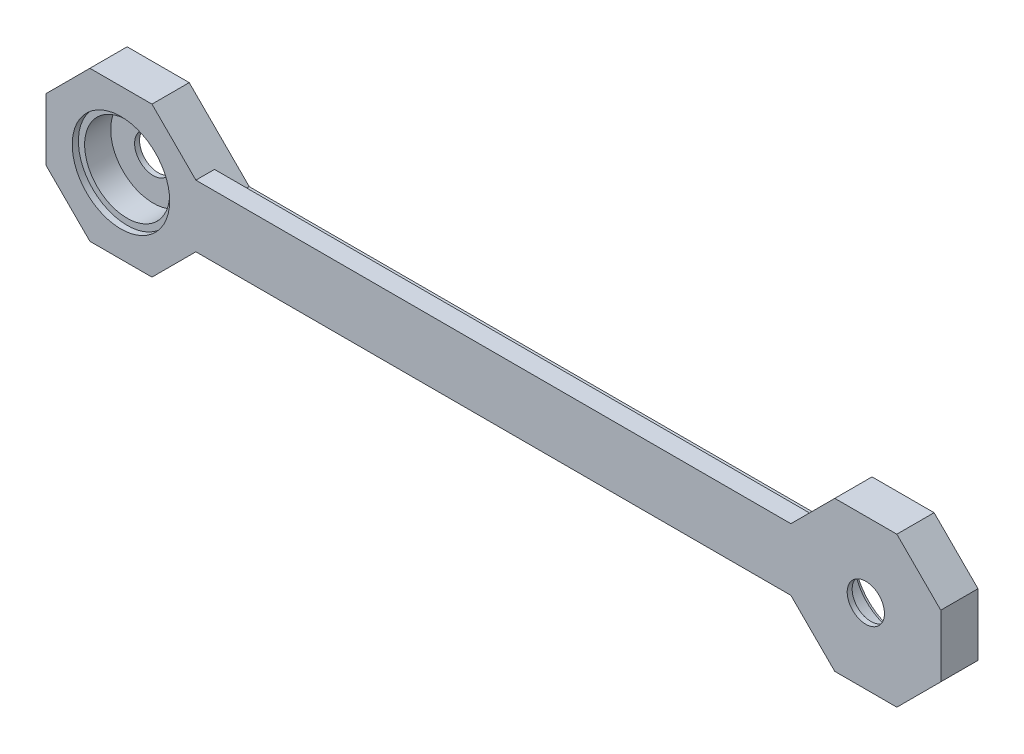
ISO-10303-21;
HEADER;
FILE_DESCRIPTION(('STEP AP214'),'2;1');
FILE_NAME('part.step','',(''),(''),'','','');
FILE_SCHEMA(('AUTOMOTIVE_DESIGN { 1 0 10303 214 1 1 1 1 }'));
ENDSEC;
DATA;
#1=APPLICATION_CONTEXT('core data for automotive mechanical design processes');
#2=APPLICATION_PROTOCOL_DEFINITION('international standard','automotive_design',2000,#1);
#3=PRODUCT_CONTEXT('',#1,'mechanical');
#4=PRODUCT('Part','Part','',(#3));
#5=PRODUCT_RELATED_PRODUCT_CATEGORY('part','',(#4));
#6=PRODUCT_DEFINITION_FORMATION('','',#4);
#7=PRODUCT_DEFINITION_CONTEXT('part definition',#1,'design');
#8=PRODUCT_DEFINITION('design','',#6,#7);
#9=PRODUCT_DEFINITION_SHAPE('','',#8);
#10=(LENGTH_UNIT() NAMED_UNIT(*) SI_UNIT(.MILLI.,.METRE.));
#11=(NAMED_UNIT(*) PLANE_ANGLE_UNIT() SI_UNIT($,.RADIAN.));
#12=(NAMED_UNIT(*) SI_UNIT($,.STERADIAN.) SOLID_ANGLE_UNIT());
#13=UNCERTAINTY_MEASURE_WITH_UNIT(LENGTH_MEASURE(1.E-05),#10,'distance_accuracy_value','');
#14=(GEOMETRIC_REPRESENTATION_CONTEXT(3) GLOBAL_UNCERTAINTY_ASSIGNED_CONTEXT((#13)) GLOBAL_UNIT_ASSIGNED_CONTEXT((#10,
#11,#12)) REPRESENTATION_CONTEXT('',''));
#15=CARTESIAN_POINT('',(0.,0.,0.));
#16=DIRECTION('',(0.,0.,1.));
#17=DIRECTION('',(1.,0.,0.));
#18=AXIS2_PLACEMENT_3D('',#15,#16,#17);
#19=CARTESIAN_POINT('',(-120.,0.,-5.2));
#20=DIRECTION('',(0.,0.,1.));
#21=DIRECTION('',(1.,0.,0.));
#22=AXIS2_PLACEMENT_3D('',#19,#20,#21);
#23=CYLINDRICAL_SURFACE('',#22,6.85);
#24=CARTESIAN_POINT('',(-120.,0.,-5.2));
#25=DIRECTION('',(0.,0.,1.));
#26=DIRECTION('',(1.,0.,0.));
#27=AXIS2_PLACEMENT_3D('',#24,#25,#26);
#28=CIRCLE('',#27,6.85);
#29=CARTESIAN_POINT('',(-113.15,0.,-5.2));
#30=VERTEX_POINT('',#29);
#31=EDGE_CURVE('E302',#30,#30,#28,.T.);
#32=ORIENTED_EDGE('',*,*,#31,.F.);
#33=EDGE_LOOP('',(#32));
#34=FACE_BOUND('',#33,.T.);
#35=CARTESIAN_POINT('',(-120.,0.,-1.));
#36=DIRECTION('',(0.,0.,1.));
#37=DIRECTION('',(1.,0.,0.));
#38=AXIS2_PLACEMENT_3D('',#35,#36,#37);
#39=CIRCLE('',#38,6.85);
#40=CARTESIAN_POINT('',(-113.15,0.,-1.));
#41=VERTEX_POINT('',#40);
#42=EDGE_CURVE('E45',#41,#41,#39,.F.);
#43=ORIENTED_EDGE('',*,*,#42,.F.);
#44=EDGE_LOOP('',(#43));
#45=FACE_BOUND('',#44,.T.);
#46=ADVANCED_FACE('F41',(#34,#45),#23,.F.);
#47=CARTESIAN_POINT('',(-120.,0.,-6.));
#48=DIRECTION('',(0.,0.,1.));
#49=DIRECTION('',(1.,0.,0.));
#50=AXIS2_PLACEMENT_3D('',#47,#48,#49);
#51=CYLINDRICAL_SURFACE('',#50,3.00000000000001);
#52=CARTESIAN_POINT('',(-120.,0.,-6.));
#53=DIRECTION('',(0.,0.,1.));
#54=DIRECTION('',(1.,0.,0.));
#55=AXIS2_PLACEMENT_3D('',#52,#53,#54);
#56=CIRCLE('',#55,3.00000000000001);
#57=CARTESIAN_POINT('',(-117.,0.,-6.));
#58=VERTEX_POINT('',#57);
#59=EDGE_CURVE('E243',#58,#58,#56,.T.);
#60=ORIENTED_EDGE('',*,*,#59,.F.);
#61=EDGE_LOOP('',(#60));
#62=FACE_BOUND('',#61,.T.);
#63=CARTESIAN_POINT('',(-120.,0.,-5.2));
#64=DIRECTION('',(0.,0.,1.));
#65=DIRECTION('',(1.,0.,0.));
#66=AXIS2_PLACEMENT_3D('',#63,#64,#65);
#67=CIRCLE('',#66,3.00000000000001);
#68=CARTESIAN_POINT('',(-117.,0.,-5.2));
#69=VERTEX_POINT('',#68);
#70=EDGE_CURVE('E298',#69,#69,#67,.F.);
#71=ORIENTED_EDGE('',*,*,#70,.F.);
#72=EDGE_LOOP('',(#71));
#73=FACE_BOUND('',#72,.T.);
#74=ADVANCED_FACE('F524',(#62,#73),#51,.F.);
#75=CARTESIAN_POINT('',(0.,0.,-0.8));
#76=DIRECTION('',(0.,0.,-1.));
#77=DIRECTION('',(-1.,0.,0.));
#78=AXIS2_PLACEMENT_3D('',#75,#76,#77);
#79=CYLINDRICAL_SURFACE('',#78,6.85);
#80=CARTESIAN_POINT('',(0.,0.,-0.8));
#81=DIRECTION('',(0.,0.,-1.));
#82=DIRECTION('',(-1.,0.,0.));
#83=AXIS2_PLACEMENT_3D('',#80,#81,#82);
#84=CIRCLE('',#83,6.85);
#85=CARTESIAN_POINT('',(-6.85,0.,-0.8));
#86=VERTEX_POINT('',#85);
#87=EDGE_CURVE('E293',#86,#86,#84,.T.);
#88=ORIENTED_EDGE('',*,*,#87,.F.);
#89=EDGE_LOOP('',(#88));
#90=FACE_BOUND('',#89,.T.);
#91=CARTESIAN_POINT('',(0.,0.,-5.));
#92=DIRECTION('',(0.,0.,-1.));
#93=DIRECTION('',(-1.,0.,0.));
#94=AXIS2_PLACEMENT_3D('',#91,#92,#93);
#95=CIRCLE('',#94,6.85);
#96=CARTESIAN_POINT('',(-6.85,0.,-5.));
#97=VERTEX_POINT('',#96);
#98=EDGE_CURVE('E294',#97,#97,#95,.F.);
#99=ORIENTED_EDGE('',*,*,#98,.F.);
#100=EDGE_LOOP('',(#99));
#101=FACE_BOUND('',#100,.T.);
#102=ADVANCED_FACE('F530',(#90,#101),#79,.F.);
#103=CARTESIAN_POINT('',(0.,0.,-6.));
#104=DIRECTION('',(0.,0.,1.));
#105=DIRECTION('',(1.,0.,0.));
#106=AXIS2_PLACEMENT_3D('',#103,#104,#105);
#107=CYLINDRICAL_SURFACE('',#106,3.);
#108=CARTESIAN_POINT('',(0.,0.,0.));
#109=DIRECTION('',(0.,0.,1.));
#110=DIRECTION('',(1.,0.,0.));
#111=AXIS2_PLACEMENT_3D('',#108,#109,#110);
#112=CIRCLE('',#111,3.);
#113=CARTESIAN_POINT('',(3.,0.,0.));
#114=VERTEX_POINT('',#113);
#115=EDGE_CURVE('E187',#114,#114,#112,.T.);
#116=ORIENTED_EDGE('',*,*,#115,.T.);
#117=EDGE_LOOP('',(#116));
#118=FACE_BOUND('',#117,.T.);
#119=CARTESIAN_POINT('',(0.,0.,-0.8));
#120=DIRECTION('',(0.,0.,-1.));
#121=DIRECTION('',(-1.,0.,0.));
#122=AXIS2_PLACEMENT_3D('',#119,#120,#121);
#123=CIRCLE('',#122,3.);
#124=CARTESIAN_POINT('',(-3.,0.,-0.8));
#125=VERTEX_POINT('',#124);
#126=EDGE_CURVE('E288',#125,#125,#123,.F.);
#127=ORIENTED_EDGE('',*,*,#126,.F.);
#128=EDGE_LOOP('',(#127));
#129=FACE_BOUND('',#128,.T.);
#130=ADVANCED_FACE('F43',(#118,#129),#107,.F.);
#131=CARTESIAN_POINT('',(-51.4644660940659,-51.4644660940671,-6.));
#132=DIRECTION('',(-0.707106781186539,-0.707106781186556,0.));
#133=DIRECTION('',(0.707106781186556,-0.707106781186539,0.));
#134=AXIS2_PLACEMENT_3D('',#131,#132,#133);
#135=PLANE('',#134);
#136=DIRECTION('',(0.,0.,1.));
#137=VECTOR('',#136,1.);
#138=CARTESIAN_POINT('',(-107.928932188134,5.,-3.));
#139=LINE('',#138,#137);
#140=CARTESIAN_POINT('',(-107.928932188134,5.,-3.));
#141=VERTEX_POINT('',#140);
#142=CARTESIAN_POINT('',(-107.928932188134,5.,0.));
#143=VERTEX_POINT('',#142);
#144=EDGE_CURVE('E346',#141,#143,#139,.T.);
#145=ORIENTED_EDGE('',*,*,#144,.F.);
#146=DIRECTION('',(-0.707106781186557,0.707106781186538,0.));
#147=VECTOR('',#146,1.);
#148=CARTESIAN_POINT('',(-51.4644660940658,-51.4644660940671,-3.));
#149=LINE('',#148,#147);
#150=CARTESIAN_POINT('',(-105.323640603008,2.39470841487357,-3.));
#151=VERTEX_POINT('',#150);
#152=EDGE_CURVE('E338',#151,#141,#149,.T.);
#153=ORIENTED_EDGE('',*,*,#152,.F.);
#154=DIRECTION('',(0.,0.,1.));
#155=VECTOR('',#154,1.);
#156=CARTESIAN_POINT('',(-105.323640603008,2.39470841487357,-6.));
#157=LINE('',#156,#155);
#158=CARTESIAN_POINT('',(-105.323640603008,2.39470841487357,-6.));
#159=VERTEX_POINT('',#158);
#160=EDGE_CURVE('E255',#159,#151,#157,.T.);
#161=ORIENTED_EDGE('',*,*,#160,.F.);
#162=DIRECTION('',(0.707106781186556,-0.707106781186539,0.));
#163=VECTOR('',#162,1.);
#164=CARTESIAN_POINT('',(-51.4644660940659,-51.4644660940671,-6.));
#165=LINE('',#164,#163);
#166=CARTESIAN_POINT('',(-115.,12.0710678118655,-6.));
#167=VERTEX_POINT('',#166);
#168=EDGE_CURVE('E419',#167,#159,#165,.T.);
#169=ORIENTED_EDGE('',*,*,#168,.F.);
#170=DIRECTION('',(0.,0.,1.));
#171=VECTOR('',#170,1.);
#172=CARTESIAN_POINT('',(-115.,12.0710678118655,-6.));
#173=LINE('',#172,#171);
#174=CARTESIAN_POINT('',(-115.,12.0710678118655,0.));
#175=VERTEX_POINT('',#174);
#176=EDGE_CURVE('E252',#167,#175,#173,.T.);
#177=ORIENTED_EDGE('',*,*,#176,.T.);
#178=DIRECTION('',(0.707106781186556,-0.707106781186539,0.));
#179=VECTOR('',#178,1.);
#180=CARTESIAN_POINT('',(-51.4644660940659,-51.4644660940671,0.));
#181=LINE('',#180,#179);
#182=EDGE_CURVE('E223',#175,#143,#181,.T.);
#183=ORIENTED_EDGE('',*,*,#182,.T.);
#184=EDGE_LOOP('',(#145,#153,#161,#169,#177,#183));
#185=FACE_BOUND('',#184,.T.);
#186=ADVANCED_FACE('F441',(#185),#135,.F.);
#187=CARTESIAN_POINT('',(0.,2.3947084148733,-6.));
#188=DIRECTION('',(0.,-1.,0.));
#189=DIRECTION('',(1.,0.,0.));
#190=AXIS2_PLACEMENT_3D('',#187,#188,#189);
#191=PLANE('',#190);
#192=DIRECTION('',(-1.,0.,0.));
#193=VECTOR('',#192,1.);
#194=CARTESIAN_POINT('',(0.,2.39470841487329,-3.));
#195=LINE('',#194,#193);
#196=CARTESIAN_POINT('',(-14.6763593969918,2.39470841487333,-3.));
#197=VERTEX_POINT('',#196);
#198=EDGE_CURVE('E326',#197,#151,#195,.T.);
#199=ORIENTED_EDGE('',*,*,#198,.F.);
#200=DIRECTION('',(0.,0.,1.));
#201=VECTOR('',#200,1.);
#202=CARTESIAN_POINT('',(-14.6763593969919,2.39470841487333,-6.));
#203=LINE('',#202,#201);
#204=CARTESIAN_POINT('',(-14.6763593969919,2.39470841487333,-6.));
#205=VERTEX_POINT('',#204);
#206=EDGE_CURVE('E259',#205,#197,#203,.T.);
#207=ORIENTED_EDGE('',*,*,#206,.F.);
#208=DIRECTION('',(1.,0.,0.));
#209=VECTOR('',#208,1.);
#210=CARTESIAN_POINT('',(0.,2.3947084148733,-6.));
#211=LINE('',#210,#209);
#212=EDGE_CURVE('E416',#159,#205,#211,.T.);
#213=ORIENTED_EDGE('',*,*,#212,.F.);
#214=ORIENTED_EDGE('',*,*,#160,.T.);
#215=EDGE_LOOP('',(#199,#207,#213,#214));
#216=FACE_BOUND('',#215,.T.);
#217=ADVANCED_FACE('F481',(#216),#191,.F.);
#218=CARTESIAN_POINT('',(-8.53553390593273,8.53553390593273,-6.));
#219=DIRECTION('',(-0.707106781186548,0.707106781186547,0.));
#220=DIRECTION('',(-0.707106781186547,-0.707106781186548,0.));
#221=AXIS2_PLACEMENT_3D('',#218,#219,#220);
#222=PLANE('',#221);
#223=DIRECTION('',(0.707106781186535,0.70710678118656,0.));
#224=VECTOR('',#223,1.);
#225=CARTESIAN_POINT('',(-8.53553390593284,8.53553390593255,-3.));
#226=LINE('',#225,#224);
#227=CARTESIAN_POINT('',(-12.0710678118653,4.99999999999999,-3.));
#228=VERTEX_POINT('',#227);
#229=EDGE_CURVE('E330',#197,#228,#226,.T.);
#230=ORIENTED_EDGE('',*,*,#229,.T.);
#231=DIRECTION('',(0.,0.,1.));
#232=VECTOR('',#231,1.);
#233=CARTESIAN_POINT('',(-12.0710678118653,4.99999999999999,-3.));
#234=LINE('',#233,#232);
#235=CARTESIAN_POINT('',(-12.0710678118653,4.99999999999999,0.));
#236=VERTEX_POINT('',#235);
#237=EDGE_CURVE('E342',#228,#236,#234,.T.);
#238=ORIENTED_EDGE('',*,*,#237,.T.);
#239=DIRECTION('',(-0.707106781186547,-0.707106781186548,0.));
#240=VECTOR('',#239,1.);
#241=CARTESIAN_POINT('',(-8.53553390593273,8.53553390593273,0.));
#242=LINE('',#241,#240);
#243=CARTESIAN_POINT('',(-5.,12.0710678118655,0.));
#244=VERTEX_POINT('',#243);
#245=EDGE_CURVE('E219',#244,#236,#242,.T.);
#246=ORIENTED_EDGE('',*,*,#245,.F.);
#247=DIRECTION('',(0.,0.,1.));
#248=VECTOR('',#247,1.);
#249=CARTESIAN_POINT('',(-5.,12.0710678118655,-6.));
#250=LINE('',#249,#248);
#251=CARTESIAN_POINT('',(-5.,12.0710678118655,-6.));
#252=VERTEX_POINT('',#251);
#253=EDGE_CURVE('E263',#252,#244,#250,.T.);
#254=ORIENTED_EDGE('',*,*,#253,.F.);
#255=DIRECTION('',(-0.707106781186547,-0.707106781186548,0.));
#256=VECTOR('',#255,1.);
#257=CARTESIAN_POINT('',(-8.53553390593273,8.53553390593273,-6.));
#258=LINE('',#257,#256);
#259=EDGE_CURVE('E412',#252,#205,#258,.T.);
#260=ORIENTED_EDGE('',*,*,#259,.T.);
#261=ORIENTED_EDGE('',*,*,#206,.T.);
#262=EDGE_LOOP('',(#230,#238,#246,#254,#260,#261));
#263=FACE_BOUND('',#262,.T.);
#264=ADVANCED_FACE('F477',(#263),#222,.T.);
#265=CARTESIAN_POINT('',(0.,-2.39470841487359,-6.));
#266=DIRECTION('',(0.,-1.,0.));
#267=DIRECTION('',(1.,0.,0.));
#268=AXIS2_PLACEMENT_3D('',#265,#266,#267);
#269=PLANE('',#268);
#270=DIRECTION('',(0.,0.,1.));
#271=VECTOR('',#270,1.);
#272=CARTESIAN_POINT('',(-14.6763593969922,-2.39470841487355,-6.));
#273=LINE('',#272,#271);
#274=CARTESIAN_POINT('',(-14.6763593969922,-2.39470841487355,-6.));
#275=VERTEX_POINT('',#274);
#276=CARTESIAN_POINT('',(-14.6763593969918,-2.39470841487333,-3.));
#277=VERTEX_POINT('',#276);
#278=EDGE_CURVE('E282',#275,#277,#273,.T.);
#279=ORIENTED_EDGE('',*,*,#278,.T.);
#280=DIRECTION('',(-1.,0.,0.));
#281=VECTOR('',#280,1.);
#282=CARTESIAN_POINT('',(0.,-2.39470841487329,-3.));
#283=LINE('',#282,#281);
#284=CARTESIAN_POINT('',(-105.323640603008,-2.39470841487357,-3.));
#285=VERTEX_POINT('',#284);
#286=EDGE_CURVE('E358',#277,#285,#283,.T.);
#287=ORIENTED_EDGE('',*,*,#286,.T.);
#288=DIRECTION('',(0.,0.,1.));
#289=VECTOR('',#288,1.);
#290=CARTESIAN_POINT('',(-105.323640603008,-2.39470841487333,-6.));
#291=LINE('',#290,#289);
#292=CARTESIAN_POINT('',(-105.323640603008,-2.39470841487333,-6.));
#293=VERTEX_POINT('',#292);
#294=EDGE_CURVE('E113',#293,#285,#291,.T.);
#295=ORIENTED_EDGE('',*,*,#294,.F.);
#296=DIRECTION('',(1.,0.,0.));
#297=VECTOR('',#296,1.);
#298=CARTESIAN_POINT('',(0.,-2.39470841487359,-6.));
#299=LINE('',#298,#297);
#300=EDGE_CURVE('E385',#293,#275,#299,.T.);
#301=ORIENTED_EDGE('',*,*,#300,.T.);
#302=EDGE_LOOP('',(#279,#287,#295,#301));
#303=FACE_BOUND('',#302,.T.);
#304=ADVANCED_FACE('F508',(#303),#269,.T.);
#305=CARTESIAN_POINT('',(-51.4644660940682,51.4644660940674,-6.));
#306=DIRECTION('',(0.707106781186553,-0.707106781186542,0.));
#307=DIRECTION('',(0.707106781186542,0.707106781186553,0.));
#308=AXIS2_PLACEMENT_3D('',#305,#306,#307);
#309=PLANE('',#308);
#310=DIRECTION('',(0.,0.,1.));
#311=VECTOR('',#310,1.);
#312=CARTESIAN_POINT('',(-107.928932188134,-5.,-3.));
#313=LINE('',#312,#311);
#314=CARTESIAN_POINT('',(-107.928932188134,-5.,-3.));
#315=VERTEX_POINT('',#314);
#316=CARTESIAN_POINT('',(-107.928932188134,-5.,0.));
#317=VERTEX_POINT('',#316);
#318=EDGE_CURVE('E369',#315,#317,#313,.T.);
#319=ORIENTED_EDGE('',*,*,#318,.T.);
#320=DIRECTION('',(0.707106781186542,0.707106781186553,0.));
#321=VECTOR('',#320,1.);
#322=CARTESIAN_POINT('',(-51.4644660940682,51.4644660940674,0.));
#323=LINE('',#322,#321);
#324=CARTESIAN_POINT('',(-115.,-12.0710678118655,0.));
#325=VERTEX_POINT('',#324);
#326=EDGE_CURVE('E191',#325,#317,#323,.T.);
#327=ORIENTED_EDGE('',*,*,#326,.F.);
#328=DIRECTION('',(0.,0.,1.));
#329=VECTOR('',#328,1.);
#330=CARTESIAN_POINT('',(-115.,-12.0710678118655,-6.));
#331=LINE('',#330,#329);
#332=CARTESIAN_POINT('',(-115.,-12.0710678118655,-6.));
#333=VERTEX_POINT('',#332);
#334=EDGE_CURVE('E11',#333,#325,#331,.T.);
#335=ORIENTED_EDGE('',*,*,#334,.F.);
#336=DIRECTION('',(0.707106781186542,0.707106781186553,0.));
#337=VECTOR('',#336,1.);
#338=CARTESIAN_POINT('',(-51.4644660940682,51.4644660940674,-6.));
#339=LINE('',#338,#337);
#340=EDGE_CURVE('E382',#333,#293,#339,.T.);
#341=ORIENTED_EDGE('',*,*,#340,.T.);
#342=ORIENTED_EDGE('',*,*,#294,.T.);
#343=DIRECTION('',(-0.707106781186557,-0.707106781186538,0.));
#344=VECTOR('',#343,1.);
#345=CARTESIAN_POINT('',(-51.4644660940658,51.4644660940671,-3.));
#346=LINE('',#345,#344);
#347=EDGE_CURVE('E361',#285,#315,#346,.T.);
#348=ORIENTED_EDGE('',*,*,#347,.T.);
#349=EDGE_LOOP('',(#319,#327,#335,#341,#342,#348));
#350=FACE_BOUND('',#349,.T.);
#351=ADVANCED_FACE('F510',(#350),#309,.T.);
#352=CARTESIAN_POINT('',(0.,-12.0710678118655,-6.));
#353=DIRECTION('',(0.,-1.,0.));
#354=DIRECTION('',(0.,0.,-1.));
#355=AXIS2_PLACEMENT_3D('',#352,#353,#354);
#356=PLANE('',#355);
#357=DIRECTION('',(1.,0.,0.));
#358=VECTOR('',#357,1.);
#359=CARTESIAN_POINT('',(0.,-12.0710678118655,0.));
#360=LINE('',#359,#358);
#361=CARTESIAN_POINT('',(-125.,-12.0710678118655,0.));
#362=VERTEX_POINT('',#361);
#363=EDGE_CURVE('E240',#362,#325,#360,.T.);
#364=ORIENTED_EDGE('',*,*,#363,.F.);
#365=DIRECTION('',(0.,0.,1.));
#366=VECTOR('',#365,1.);
#367=CARTESIAN_POINT('',(-125.,-12.0710678118655,-6.));
#368=LINE('',#367,#366);
#369=CARTESIAN_POINT('',(-125.,-12.0710678118655,-6.));
#370=VERTEX_POINT('',#369);
#371=EDGE_CURVE('E52',#370,#362,#368,.T.);
#372=ORIENTED_EDGE('',*,*,#371,.F.);
#373=DIRECTION('',(1.,0.,0.));
#374=VECTOR('',#373,1.);
#375=CARTESIAN_POINT('',(0.,-12.0710678118655,-6.));
#376=LINE('',#375,#374);
#377=EDGE_CURVE('E173',#370,#333,#376,.T.);
#378=ORIENTED_EDGE('',*,*,#377,.T.);
#379=ORIENTED_EDGE('',*,*,#334,.T.);
#380=EDGE_LOOP('',(#364,#372,#378,#379));
#381=FACE_BOUND('',#380,.T.);
#382=ADVANCED_FACE('F511',(#381),#356,.T.);
#383=CARTESIAN_POINT('',(-68.5355339059329,-68.5355339059327,-6.));
#384=DIRECTION('',(-0.707106781186548,-0.707106781186546,0.));
#385=DIRECTION('',(0.707106781186546,-0.707106781186549,0.));
#386=AXIS2_PLACEMENT_3D('',#383,#384,#385);
#387=PLANE('',#386);
#388=DIRECTION('',(0.707106781186546,-0.707106781186549,0.));
#389=VECTOR('',#388,1.);
#390=CARTESIAN_POINT('',(-68.5355339059329,-68.5355339059327,0.));
#391=LINE('',#390,#389);
#392=CARTESIAN_POINT('',(-132.071067811865,-4.99999999999998,0.));
#393=VERTEX_POINT('',#392);
#394=EDGE_CURVE('E159',#393,#362,#391,.T.);
#395=ORIENTED_EDGE('',*,*,#394,.F.);
#396=DIRECTION('',(0.,0.,1.));
#397=VECTOR('',#396,1.);
#398=CARTESIAN_POINT('',(-132.071067811865,-4.99999999999998,-6.));
#399=LINE('',#398,#397);
#400=CARTESIAN_POINT('',(-132.071067811865,-4.99999999999998,-6.));
#401=VERTEX_POINT('',#400);
#402=EDGE_CURVE('E154',#401,#393,#399,.T.);
#403=ORIENTED_EDGE('',*,*,#402,.F.);
#404=DIRECTION('',(0.707106781186546,-0.707106781186549,0.));
#405=VECTOR('',#404,1.);
#406=CARTESIAN_POINT('',(-68.5355339059329,-68.5355339059327,-6.));
#407=LINE('',#406,#405);
#408=EDGE_CURVE('E157',#401,#370,#407,.T.);
#409=ORIENTED_EDGE('',*,*,#408,.T.);
#410=ORIENTED_EDGE('',*,*,#371,.T.);
#411=EDGE_LOOP('',(#395,#403,#409,#410));
#412=FACE_BOUND('',#411,.T.);
#413=ADVANCED_FACE('F156',(#412),#387,.T.);
#414=CARTESIAN_POINT('',(-132.071067811865,0.,-6.));
#415=DIRECTION('',(-1.,0.,0.));
#416=DIRECTION('',(0.,0.,1.));
#417=AXIS2_PLACEMENT_3D('',#414,#415,#416);
#418=PLANE('',#417);
#419=DIRECTION('',(0.,-1.,0.));
#420=VECTOR('',#419,1.);
#421=CARTESIAN_POINT('',(-132.071067811865,0.,0.));
#422=LINE('',#421,#420);
#423=CARTESIAN_POINT('',(-132.071067811865,5.00000000000002,0.));
#424=VERTEX_POINT('',#423);
#425=EDGE_CURVE('E235',#424,#393,#422,.T.);
#426=ORIENTED_EDGE('',*,*,#425,.F.);
#427=DIRECTION('',(0.,0.,1.));
#428=VECTOR('',#427,1.);
#429=CARTESIAN_POINT('',(-132.071067811865,5.00000000000002,-6.));
#430=LINE('',#429,#428);
#431=CARTESIAN_POINT('',(-132.071067811865,5.00000000000002,-6.));
#432=VERTEX_POINT('',#431);
#433=EDGE_CURVE('E165',#432,#424,#430,.T.);
#434=ORIENTED_EDGE('',*,*,#433,.F.);
#435=DIRECTION('',(0.,-1.,0.));
#436=VECTOR('',#435,1.);
#437=CARTESIAN_POINT('',(-132.071067811865,0.,-6.));
#438=LINE('',#437,#436);
#439=EDGE_CURVE('E171',#432,#401,#438,.T.);
#440=ORIENTED_EDGE('',*,*,#439,.T.);
#441=ORIENTED_EDGE('',*,*,#402,.T.);
#442=EDGE_LOOP('',(#426,#434,#440,#441));
#443=FACE_BOUND('',#442,.T.);
#444=ADVANCED_FACE('F176',(#443),#418,.T.);
#445=CARTESIAN_POINT('',(-68.5355339059326,68.5355339059327,-6.));
#446=DIRECTION('',(-0.707106781186547,0.707106781186548,0.));
#447=DIRECTION('',(-0.707106781186548,-0.707106781186547,0.));
#448=AXIS2_PLACEMENT_3D('',#445,#446,#447);
#449=PLANE('',#448);
#450=DIRECTION('',(-0.707106781186548,-0.707106781186547,0.));
#451=VECTOR('',#450,1.);
#452=CARTESIAN_POINT('',(-68.5355339059326,68.5355339059327,0.));
#453=LINE('',#452,#451);
#454=CARTESIAN_POINT('',(-125.,12.0710678118655,0.));
#455=VERTEX_POINT('',#454);
#456=EDGE_CURVE('E231',#455,#424,#453,.T.);
#457=ORIENTED_EDGE('',*,*,#456,.F.);
#458=DIRECTION('',(0.,0.,1.));
#459=VECTOR('',#458,1.);
#460=CARTESIAN_POINT('',(-125.,12.0710678118655,-6.));
#461=LINE('',#460,#459);
#462=CARTESIAN_POINT('',(-125.,12.0710678118655,-6.));
#463=VERTEX_POINT('',#462);
#464=EDGE_CURVE('E249',#463,#455,#461,.T.);
#465=ORIENTED_EDGE('',*,*,#464,.F.);
#466=DIRECTION('',(-0.707106781186548,-0.707106781186547,0.));
#467=VECTOR('',#466,1.);
#468=CARTESIAN_POINT('',(-68.5355339059326,68.5355339059327,-6.));
#469=LINE('',#468,#467);
#470=EDGE_CURVE('E178',#463,#432,#469,.T.);
#471=ORIENTED_EDGE('',*,*,#470,.T.);
#472=ORIENTED_EDGE('',*,*,#433,.T.);
#473=EDGE_LOOP('',(#457,#465,#471,#472));
#474=FACE_BOUND('',#473,.T.);
#475=ADVANCED_FACE('F432',(#474),#449,.T.);
#476=CARTESIAN_POINT('',(0.,12.0710678118655,-6.));
#477=DIRECTION('',(0.,1.,0.));
#478=DIRECTION('',(-1.,0.,0.));
#479=AXIS2_PLACEMENT_3D('',#476,#477,#478);
#480=PLANE('',#479);
#481=DIRECTION('',(-1.,0.,0.));
#482=VECTOR('',#481,1.);
#483=CARTESIAN_POINT('',(0.,12.0710678118655,0.));
#484=LINE('',#483,#482);
#485=EDGE_CURVE('E227',#175,#455,#484,.T.);
#486=ORIENTED_EDGE('',*,*,#485,.F.);
#487=ORIENTED_EDGE('',*,*,#176,.F.);
#488=DIRECTION('',(-1.,0.,0.));
#489=VECTOR('',#488,1.);
#490=CARTESIAN_POINT('',(0.,12.0710678118655,-6.));
#491=LINE('',#490,#489);
#492=EDGE_CURVE('E181',#167,#463,#491,.T.);
#493=ORIENTED_EDGE('',*,*,#492,.T.);
#494=ORIENTED_EDGE('',*,*,#464,.T.);
#495=EDGE_LOOP('',(#486,#487,#493,#494));
#496=FACE_BOUND('',#495,.T.);
#497=ADVANCED_FACE('F427',(#496),#480,.T.);
#498=CARTESIAN_POINT('',(0.,12.0710678118655,-6.));
#499=DIRECTION('',(0.,1.,0.));
#500=DIRECTION('',(-1.,0.,0.));
#501=AXIS2_PLACEMENT_3D('',#498,#499,#500);
#502=PLANE('',#501);
#503=DIRECTION('',(-1.,0.,0.));
#504=VECTOR('',#503,1.);
#505=CARTESIAN_POINT('',(0.,12.0710678118655,0.));
#506=LINE('',#505,#504);
#507=CARTESIAN_POINT('',(5.,12.0710678118655,0.));
#508=VERTEX_POINT('',#507);
#509=EDGE_CURVE('E215',#508,#244,#506,.T.);
#510=ORIENTED_EDGE('',*,*,#509,.F.);
#511=DIRECTION('',(0.,0.,1.));
#512=VECTOR('',#511,1.);
#513=CARTESIAN_POINT('',(5.,12.0710678118655,-6.));
#514=LINE('',#513,#512);
#515=CARTESIAN_POINT('',(5.,12.0710678118655,-6.));
#516=VERTEX_POINT('',#515);
#517=EDGE_CURVE('E266',#516,#508,#514,.T.);
#518=ORIENTED_EDGE('',*,*,#517,.F.);
#519=DIRECTION('',(-1.,0.,0.));
#520=VECTOR('',#519,1.);
#521=CARTESIAN_POINT('',(0.,12.0710678118655,-6.));
#522=LINE('',#521,#520);
#523=EDGE_CURVE('E408',#516,#252,#522,.T.);
#524=ORIENTED_EDGE('',*,*,#523,.T.);
#525=ORIENTED_EDGE('',*,*,#253,.T.);
#526=EDGE_LOOP('',(#510,#518,#524,#525));
#527=FACE_BOUND('',#526,.T.);
#528=ADVANCED_FACE('F486',(#527),#502,.T.);
#529=CARTESIAN_POINT('',(8.53553390593274,8.53553390593273,-6.));
#530=DIRECTION('',(0.707106781186548,0.707106781186547,0.));
#531=DIRECTION('',(-0.707106781186547,0.707106781186548,0.));
#532=AXIS2_PLACEMENT_3D('',#529,#530,#531);
#533=PLANE('',#532);
#534=DIRECTION('',(-0.707106781186547,0.707106781186548,0.));
#535=VECTOR('',#534,1.);
#536=CARTESIAN_POINT('',(8.53553390593274,8.53553390593273,0.));
#537=LINE('',#536,#535);
#538=CARTESIAN_POINT('',(12.0710678118655,5.,0.));
#539=VERTEX_POINT('',#538);
#540=EDGE_CURVE('E211',#539,#508,#537,.T.);
#541=ORIENTED_EDGE('',*,*,#540,.F.);
#542=DIRECTION('',(0.,0.,1.));
#543=VECTOR('',#542,1.);
#544=CARTESIAN_POINT('',(12.0710678118655,5.,-6.));
#545=LINE('',#544,#543);
#546=CARTESIAN_POINT('',(12.0710678118655,5.,-6.));
#547=VERTEX_POINT('',#546);
#548=EDGE_CURVE('E269',#547,#539,#545,.T.);
#549=ORIENTED_EDGE('',*,*,#548,.F.);
#550=DIRECTION('',(-0.707106781186547,0.707106781186548,0.));
#551=VECTOR('',#550,1.);
#552=CARTESIAN_POINT('',(8.53553390593274,8.53553390593273,-6.));
#553=LINE('',#552,#551);
#554=EDGE_CURVE('E404',#547,#516,#553,.T.);
#555=ORIENTED_EDGE('',*,*,#554,.T.);
#556=ORIENTED_EDGE('',*,*,#517,.T.);
#557=EDGE_LOOP('',(#541,#549,#555,#556));
#558=FACE_BOUND('',#557,.T.);
#559=ADVANCED_FACE('F489',(#558),#533,.T.);
#560=CARTESIAN_POINT('',(12.0710678118655,0.,-6.));
#561=DIRECTION('',(1.,0.,0.));
#562=DIRECTION('',(0.,0.,-1.));
#563=AXIS2_PLACEMENT_3D('',#560,#561,#562);
#564=PLANE('',#563);
#565=DIRECTION('',(0.,1.,0.));
#566=VECTOR('',#565,1.);
#567=CARTESIAN_POINT('',(12.0710678118655,0.,0.));
#568=LINE('',#567,#566);
#569=CARTESIAN_POINT('',(12.0710678118655,-5.,0.));
#570=VERTEX_POINT('',#569);
#571=EDGE_CURVE('E207',#570,#539,#568,.T.);
#572=ORIENTED_EDGE('',*,*,#571,.F.);
#573=DIRECTION('',(0.,0.,1.));
#574=VECTOR('',#573,1.);
#575=CARTESIAN_POINT('',(12.0710678118655,-5.,-6.));
#576=LINE('',#575,#574);
#577=CARTESIAN_POINT('',(12.0710678118655,-5.,-6.));
#578=VERTEX_POINT('',#577);
#579=EDGE_CURVE('E272',#578,#570,#576,.T.);
#580=ORIENTED_EDGE('',*,*,#579,.F.);
#581=DIRECTION('',(0.,1.,0.));
#582=VECTOR('',#581,1.);
#583=CARTESIAN_POINT('',(12.0710678118655,0.,-6.));
#584=LINE('',#583,#582);
#585=EDGE_CURVE('E400',#578,#547,#584,.T.);
#586=ORIENTED_EDGE('',*,*,#585,.T.);
#587=ORIENTED_EDGE('',*,*,#548,.T.);
#588=EDGE_LOOP('',(#572,#580,#586,#587));
#589=FACE_BOUND('',#588,.T.);
#590=ADVANCED_FACE('F494',(#589),#564,.T.);
#591=CARTESIAN_POINT('',(8.53553390593273,-8.53553390593273,-6.));
#592=DIRECTION('',(0.707106781186548,-0.707106781186547,0.));
#593=DIRECTION('',(0.707106781186547,0.707106781186548,0.));
#594=AXIS2_PLACEMENT_3D('',#591,#592,#593);
#595=PLANE('',#594);
#596=DIRECTION('',(0.707106781186547,0.707106781186548,0.));
#597=VECTOR('',#596,1.);
#598=CARTESIAN_POINT('',(8.53553390593273,-8.53553390593273,0.));
#599=LINE('',#598,#597);
#600=CARTESIAN_POINT('',(5.,-12.0710678118655,0.));
#601=VERTEX_POINT('',#600);
#602=EDGE_CURVE('E203',#601,#570,#599,.T.);
#603=ORIENTED_EDGE('',*,*,#602,.F.);
#604=DIRECTION('',(0.,0.,1.));
#605=VECTOR('',#604,1.);
#606=CARTESIAN_POINT('',(5.,-12.0710678118655,-6.));
#607=LINE('',#606,#605);
#608=CARTESIAN_POINT('',(5.,-12.0710678118655,-6.));
#609=VERTEX_POINT('',#608);
#610=EDGE_CURVE('E275',#609,#601,#607,.T.);
#611=ORIENTED_EDGE('',*,*,#610,.F.);
#612=DIRECTION('',(0.707106781186547,0.707106781186548,0.));
#613=VECTOR('',#612,1.);
#614=CARTESIAN_POINT('',(8.53553390593273,-8.53553390593273,-6.));
#615=LINE('',#614,#613);
#616=EDGE_CURVE('E396',#609,#578,#615,.T.);
#617=ORIENTED_EDGE('',*,*,#616,.T.);
#618=ORIENTED_EDGE('',*,*,#579,.T.);
#619=EDGE_LOOP('',(#603,#611,#617,#618));
#620=FACE_BOUND('',#619,.T.);
#621=ADVANCED_FACE('F497',(#620),#595,.T.);
#622=CARTESIAN_POINT('',(0.,-12.0710678118655,-6.));
#623=DIRECTION('',(0.,-1.,0.));
#624=DIRECTION('',(0.,0.,-1.));
#625=AXIS2_PLACEMENT_3D('',#622,#623,#624);
#626=PLANE('',#625);
#627=DIRECTION('',(1.,0.,0.));
#628=VECTOR('',#627,1.);
#629=CARTESIAN_POINT('',(0.,-12.0710678118655,0.));
#630=LINE('',#629,#628);
#631=CARTESIAN_POINT('',(-4.99999999999999,-12.0710678118655,0.));
#632=VERTEX_POINT('',#631);
#633=EDGE_CURVE('E199',#632,#601,#630,.T.);
#634=ORIENTED_EDGE('',*,*,#633,.F.);
#635=DIRECTION('',(0.,0.,1.));
#636=VECTOR('',#635,1.);
#637=CARTESIAN_POINT('',(-4.99999999999999,-12.0710678118655,-6.));
#638=LINE('',#637,#636);
#639=CARTESIAN_POINT('',(-4.99999999999999,-12.0710678118655,-6.));
#640=VERTEX_POINT('',#639);
#641=EDGE_CURVE('E278',#640,#632,#638,.T.);
#642=ORIENTED_EDGE('',*,*,#641,.F.);
#643=DIRECTION('',(1.,0.,0.));
#644=VECTOR('',#643,1.);
#645=CARTESIAN_POINT('',(0.,-12.0710678118655,-6.));
#646=LINE('',#645,#644);
#647=EDGE_CURVE('E392',#640,#609,#646,.T.);
#648=ORIENTED_EDGE('',*,*,#647,.T.);
#649=ORIENTED_EDGE('',*,*,#610,.T.);
#650=EDGE_LOOP('',(#634,#642,#648,#649));
#651=FACE_BOUND('',#650,.T.);
#652=ADVANCED_FACE('F502',(#651),#626,.T.);
#653=CARTESIAN_POINT('',(-8.53553390593266,-8.5355339059329,-6.));
#654=DIRECTION('',(-0.707106781186538,-0.707106781186557,0.));
#655=DIRECTION('',(0.707106781186557,-0.707106781186538,0.));
#656=AXIS2_PLACEMENT_3D('',#653,#654,#655);
#657=PLANE('',#656);
#658=DIRECTION('',(0.,0.,1.));
#659=VECTOR('',#658,1.);
#660=CARTESIAN_POINT('',(-12.0710678118653,-4.99999999999999,-3.));
#661=LINE('',#660,#659);
#662=CARTESIAN_POINT('',(-12.0710678118653,-4.99999999999999,-3.));
#663=VERTEX_POINT('',#662);
#664=CARTESIAN_POINT('',(-12.0710678118653,-4.99999999999999,0.));
#665=VERTEX_POINT('',#664);
#666=EDGE_CURVE('E192',#663,#665,#661,.T.);
#667=ORIENTED_EDGE('',*,*,#666,.F.);
#668=DIRECTION('',(0.707106781186535,-0.70710678118656,0.));
#669=VECTOR('',#668,1.);
#670=CARTESIAN_POINT('',(-8.53553390593284,-8.53553390593255,-3.));
#671=LINE('',#670,#669);
#672=EDGE_CURVE('E354',#277,#663,#671,.T.);
#673=ORIENTED_EDGE('',*,*,#672,.F.);
#674=ORIENTED_EDGE('',*,*,#278,.F.);
#675=DIRECTION('',(0.707106781186557,-0.707106781186538,0.));
#676=VECTOR('',#675,1.);
#677=CARTESIAN_POINT('',(-8.53553390593266,-8.5355339059329,-6.));
#678=LINE('',#677,#676);
#679=EDGE_CURVE('E388',#275,#640,#678,.T.);
#680=ORIENTED_EDGE('',*,*,#679,.T.);
#681=ORIENTED_EDGE('',*,*,#641,.T.);
#682=DIRECTION('',(0.707106781186557,-0.707106781186538,0.));
#683=VECTOR('',#682,1.);
#684=CARTESIAN_POINT('',(-8.53553390593266,-8.5355339059329,0.));
#685=LINE('',#684,#683);
#686=EDGE_CURVE('E196',#665,#632,#685,.T.);
#687=ORIENTED_EDGE('',*,*,#686,.F.);
#688=EDGE_LOOP('',(#667,#673,#674,#680,#681,#687));
#689=FACE_BOUND('',#688,.T.);
#690=ADVANCED_FACE('F506',(#689),#657,.T.);
#691=CARTESIAN_POINT('',(0.,0.,-6.));
#692=DIRECTION('',(0.,0.,1.));
#693=DIRECTION('',(1.,0.,0.));
#694=AXIS2_PLACEMENT_3D('',#691,#692,#693);
#695=PLANE('',#694);
#696=CARTESIAN_POINT('',(0.,0.,-6.));
#697=DIRECTION('',(0.,0.,-1.));
#698=DIRECTION('',(-1.,0.,0.));
#699=AXIS2_PLACEMENT_3D('',#696,#697,#698);
#700=CIRCLE('',#699,7.85);
#701=CARTESIAN_POINT('',(-7.85,0.,-6.));
#702=VERTEX_POINT('',#701);
#703=EDGE_CURVE('E301',#702,#702,#700,.T.);
#704=ORIENTED_EDGE('',*,*,#703,.F.);
#705=EDGE_LOOP('',(#704));
#706=FACE_BOUND('',#705,.T.);
#707=ORIENTED_EDGE('',*,*,#59,.T.);
#708=EDGE_LOOP('',(#707));
#709=FACE_BOUND('',#708,.T.);
#710=ORIENTED_EDGE('',*,*,#340,.F.);
#711=ORIENTED_EDGE('',*,*,#377,.F.);
#712=ORIENTED_EDGE('',*,*,#408,.F.);
#713=ORIENTED_EDGE('',*,*,#439,.F.);
#714=ORIENTED_EDGE('',*,*,#470,.F.);
#715=ORIENTED_EDGE('',*,*,#492,.F.);
#716=ORIENTED_EDGE('',*,*,#168,.T.);
#717=ORIENTED_EDGE('',*,*,#212,.T.);
#718=ORIENTED_EDGE('',*,*,#259,.F.);
#719=ORIENTED_EDGE('',*,*,#523,.F.);
#720=ORIENTED_EDGE('',*,*,#554,.F.);
#721=ORIENTED_EDGE('',*,*,#585,.F.);
#722=ORIENTED_EDGE('',*,*,#616,.F.);
#723=ORIENTED_EDGE('',*,*,#647,.F.);
#724=ORIENTED_EDGE('',*,*,#679,.F.);
#725=ORIENTED_EDGE('',*,*,#300,.F.);
#726=EDGE_LOOP('',(#710,#711,#712,#713,#714,#715,#716,#717,#718,#719,#720,#721,#722,#723,#724,#725));
#727=FACE_BOUND('',#726,.T.);
#728=ADVANCED_FACE('F169',(#706,#709,#727),#695,.F.);
#729=CARTESIAN_POINT('',(0.,0.,0.));
#730=DIRECTION('',(0.,0.,1.));
#731=DIRECTION('',(1.,0.,0.));
#732=AXIS2_PLACEMENT_3D('',#729,#730,#731);
#733=PLANE('',#732);
#734=CARTESIAN_POINT('',(-120.,0.,0.));
#735=DIRECTION('',(0.,0.,1.));
#736=DIRECTION('',(1.,0.,0.));
#737=AXIS2_PLACEMENT_3D('',#734,#735,#736);
#738=CIRCLE('',#737,7.84999999999999);
#739=CARTESIAN_POINT('',(-112.15,0.,0.));
#740=VERTEX_POINT('',#739);
#741=EDGE_CURVE('E318',#740,#740,#738,.T.);
#742=ORIENTED_EDGE('',*,*,#741,.F.);
#743=EDGE_LOOP('',(#742));
#744=FACE_BOUND('',#743,.T.);
#745=DIRECTION('',(1.,0.,0.));
#746=VECTOR('',#745,1.);
#747=CARTESIAN_POINT('',(0.,4.99999999999999,0.));
#748=LINE('',#747,#746);
#749=EDGE_CURVE('E292',#143,#236,#748,.T.);
#750=ORIENTED_EDGE('',*,*,#749,.F.);
#751=ORIENTED_EDGE('',*,*,#182,.F.);
#752=ORIENTED_EDGE('',*,*,#485,.T.);
#753=ORIENTED_EDGE('',*,*,#456,.T.);
#754=ORIENTED_EDGE('',*,*,#425,.T.);
#755=ORIENTED_EDGE('',*,*,#394,.T.);
#756=ORIENTED_EDGE('',*,*,#363,.T.);
#757=ORIENTED_EDGE('',*,*,#326,.T.);
#758=DIRECTION('',(1.,0.,0.));
#759=VECTOR('',#758,1.);
#760=CARTESIAN_POINT('',(0.,-4.99999999999999,0.));
#761=LINE('',#760,#759);
#762=EDGE_CURVE('E350',#317,#665,#761,.T.);
#763=ORIENTED_EDGE('',*,*,#762,.T.);
#764=ORIENTED_EDGE('',*,*,#686,.T.);
#765=ORIENTED_EDGE('',*,*,#633,.T.);
#766=ORIENTED_EDGE('',*,*,#602,.T.);
#767=ORIENTED_EDGE('',*,*,#571,.T.);
#768=ORIENTED_EDGE('',*,*,#540,.T.);
#769=ORIENTED_EDGE('',*,*,#509,.T.);
#770=ORIENTED_EDGE('',*,*,#245,.T.);
#771=EDGE_LOOP('',(#750,#751,#752,#753,#754,#755,#756,#757,#763,#764,#765,#766,#767,#768,#769,#770));
#772=FACE_BOUND('',#771,.T.);
#773=ORIENTED_EDGE('',*,*,#115,.F.);
#774=EDGE_LOOP('',(#773));
#775=FACE_BOUND('',#774,.T.);
#776=ADVANCED_FACE('F436',(#744,#772,#775),#733,.T.);
#777=CARTESIAN_POINT('',(0.,-4.99999999999999,-3.));
#778=DIRECTION('',(0.,-1.,0.));
#779=DIRECTION('',(1.,0.,0.));
#780=AXIS2_PLACEMENT_3D('',#777,#778,#779);
#781=PLANE('',#780);
#782=ORIENTED_EDGE('',*,*,#762,.F.);
#783=ORIENTED_EDGE('',*,*,#318,.F.);
#784=DIRECTION('',(1.,0.,0.));
#785=VECTOR('',#784,1.);
#786=CARTESIAN_POINT('',(0.,-4.99999999999999,-3.));
#787=LINE('',#786,#785);
#788=EDGE_CURVE('E365',#315,#663,#787,.T.);
#789=ORIENTED_EDGE('',*,*,#788,.T.);
#790=ORIENTED_EDGE('',*,*,#666,.T.);
#791=EDGE_LOOP('',(#782,#783,#789,#790));
#792=FACE_BOUND('',#791,.T.);
#793=ADVANCED_FACE('F513',(#792),#781,.T.);
#794=CARTESIAN_POINT('',(0.,0.,-3.));
#795=DIRECTION('',(0.,0.,1.));
#796=DIRECTION('',(1.,0.,0.));
#797=AXIS2_PLACEMENT_3D('',#794,#795,#796);
#798=PLANE('',#797);
#799=ORIENTED_EDGE('',*,*,#672,.T.);
#800=ORIENTED_EDGE('',*,*,#788,.F.);
#801=ORIENTED_EDGE('',*,*,#347,.F.);
#802=ORIENTED_EDGE('',*,*,#286,.F.);
#803=EDGE_LOOP('',(#799,#800,#801,#802));
#804=FACE_BOUND('',#803,.T.);
#805=ADVANCED_FACE('F514',(#804),#798,.F.);
#806=CARTESIAN_POINT('',(0.,4.99999999999999,-3.));
#807=DIRECTION('',(0.,-1.,0.));
#808=DIRECTION('',(1.,0.,0.));
#809=AXIS2_PLACEMENT_3D('',#806,#807,#808);
#810=PLANE('',#809);
#811=ORIENTED_EDGE('',*,*,#749,.T.);
#812=ORIENTED_EDGE('',*,*,#237,.F.);
#813=DIRECTION('',(1.,0.,0.));
#814=VECTOR('',#813,1.);
#815=CARTESIAN_POINT('',(0.,4.99999999999999,-3.));
#816=LINE('',#815,#814);
#817=EDGE_CURVE('E334',#141,#228,#816,.T.);
#818=ORIENTED_EDGE('',*,*,#817,.F.);
#819=ORIENTED_EDGE('',*,*,#144,.T.);
#820=EDGE_LOOP('',(#811,#812,#818,#819));
#821=FACE_BOUND('',#820,.T.);
#822=ADVANCED_FACE('F474',(#821),#810,.F.);
#823=CARTESIAN_POINT('',(0.,0.,-3.));
#824=DIRECTION('',(0.,0.,1.));
#825=DIRECTION('',(1.,0.,0.));
#826=AXIS2_PLACEMENT_3D('',#823,#824,#825);
#827=PLANE('',#826);
#828=ORIENTED_EDGE('',*,*,#198,.T.);
#829=ORIENTED_EDGE('',*,*,#152,.T.);
#830=ORIENTED_EDGE('',*,*,#817,.T.);
#831=ORIENTED_EDGE('',*,*,#229,.F.);
#832=EDGE_LOOP('',(#828,#829,#830,#831));
#833=FACE_BOUND('',#832,.T.);
#834=ADVANCED_FACE('F473',(#833),#827,.F.);
#835=CARTESIAN_POINT('',(0.,0.,-0.8));
#836=DIRECTION('',(0.,0.,-1.));
#837=DIRECTION('',(-1.,0.,0.));
#838=AXIS2_PLACEMENT_3D('',#835,#836,#837);
#839=PLANE('',#838);
#840=ORIENTED_EDGE('',*,*,#87,.T.);
#841=EDGE_LOOP('',(#840));
#842=FACE_BOUND('',#841,.T.);
#843=ORIENTED_EDGE('',*,*,#126,.T.);
#844=EDGE_LOOP('',(#843));
#845=FACE_BOUND('',#844,.T.);
#846=ADVANCED_FACE('F541',(#842,#845),#839,.T.);
#847=CARTESIAN_POINT('',(0.,0.,-5.));
#848=DIRECTION('',(0.,0.,-1.));
#849=DIRECTION('',(-1.,0.,0.));
#850=AXIS2_PLACEMENT_3D('',#847,#848,#849);
#851=PLANE('',#850);
#852=CARTESIAN_POINT('',(0.,0.,-5.));
#853=DIRECTION('',(0.,0.,-1.));
#854=DIRECTION('',(-1.,0.,0.));
#855=AXIS2_PLACEMENT_3D('',#852,#853,#854);
#856=CIRCLE('',#855,7.85);
#857=CARTESIAN_POINT('',(-7.85,0.,-5.));
#858=VERTEX_POINT('',#857);
#859=EDGE_CURVE('E297',#858,#858,#856,.T.);
#860=ORIENTED_EDGE('',*,*,#859,.T.);
#861=EDGE_LOOP('',(#860));
#862=FACE_BOUND('',#861,.T.);
#863=ORIENTED_EDGE('',*,*,#98,.T.);
#864=EDGE_LOOP('',(#863));
#865=FACE_BOUND('',#864,.T.);
#866=ADVANCED_FACE('F537',(#862,#865),#851,.T.);
#867=CARTESIAN_POINT('',(0.,0.,-5.));
#868=DIRECTION('',(0.,0.,-1.));
#869=DIRECTION('',(-1.,0.,0.));
#870=AXIS2_PLACEMENT_3D('',#867,#868,#869);
#871=CYLINDRICAL_SURFACE('',#870,7.85);
#872=ORIENTED_EDGE('',*,*,#859,.F.);
#873=EDGE_LOOP('',(#872));
#874=FACE_BOUND('',#873,.T.);
#875=ORIENTED_EDGE('',*,*,#703,.T.);
#876=EDGE_LOOP('',(#875));
#877=FACE_BOUND('',#876,.T.);
#878=ADVANCED_FACE('F540',(#874,#877),#871,.F.);
#879=CARTESIAN_POINT('',(-120.,0.,-5.2));
#880=DIRECTION('',(0.,0.,1.));
#881=DIRECTION('',(1.,0.,0.));
#882=AXIS2_PLACEMENT_3D('',#879,#880,#881);
#883=PLANE('',#882);
#884=ORIENTED_EDGE('',*,*,#31,.T.);
#885=EDGE_LOOP('',(#884));
#886=FACE_BOUND('',#885,.T.);
#887=ORIENTED_EDGE('',*,*,#70,.T.);
#888=EDGE_LOOP('',(#887));
#889=FACE_BOUND('',#888,.T.);
#890=ADVANCED_FACE('F535',(#886,#889),#883,.T.);
#891=CARTESIAN_POINT('',(-120.,0.,-1.));
#892=DIRECTION('',(0.,0.,1.));
#893=DIRECTION('',(1.,0.,0.));
#894=AXIS2_PLACEMENT_3D('',#891,#892,#893);
#895=PLANE('',#894);
#896=CARTESIAN_POINT('',(-120.,0.,-1.));
#897=DIRECTION('',(0.,0.,1.));
#898=DIRECTION('',(1.,0.,0.));
#899=AXIS2_PLACEMENT_3D('',#896,#897,#898);
#900=CIRCLE('',#899,7.84999999999999);
#901=CARTESIAN_POINT('',(-112.15,0.,-1.));
#902=VERTEX_POINT('',#901);
#903=EDGE_CURVE('E315',#902,#902,#900,.T.);
#904=ORIENTED_EDGE('',*,*,#903,.T.);
#905=EDGE_LOOP('',(#904));
#906=FACE_BOUND('',#905,.T.);
#907=ORIENTED_EDGE('',*,*,#42,.T.);
#908=EDGE_LOOP('',(#907));
#909=FACE_BOUND('',#908,.T.);
#910=ADVANCED_FACE('F579',(#906,#909),#895,.T.);
#911=CARTESIAN_POINT('',(-120.,0.,-1.));
#912=DIRECTION('',(0.,0.,1.));
#913=DIRECTION('',(1.,0.,0.));
#914=AXIS2_PLACEMENT_3D('',#911,#912,#913);
#915=CYLINDRICAL_SURFACE('',#914,7.84999999999999);
#916=ORIENTED_EDGE('',*,*,#903,.F.);
#917=EDGE_LOOP('',(#916));
#918=FACE_BOUND('',#917,.T.);
#919=ORIENTED_EDGE('',*,*,#741,.T.);
#920=EDGE_LOOP('',(#919));
#921=FACE_BOUND('',#920,.T.);
#922=ADVANCED_FACE('F585',(#918,#921),#915,.F.);
#923=CLOSED_SHELL('',(#46,#74,#102,#130,#186,#217,#264,#304,#351,#382,#413,#444,#475,#497,#528,
#559,#590,#621,#652,#690,#728,#776,#793,#805,#822,#834,#846,#866,#878,#890,#910,#922));
#924=MANIFOLD_SOLID_BREP('B2',#923);
#925=ADVANCED_BREP_SHAPE_REPRESENTATION('',(#18,#924),#14);
#926=SHAPE_DEFINITION_REPRESENTATION(#9,#925);
ENDSEC;
END-ISO-10303-21;
